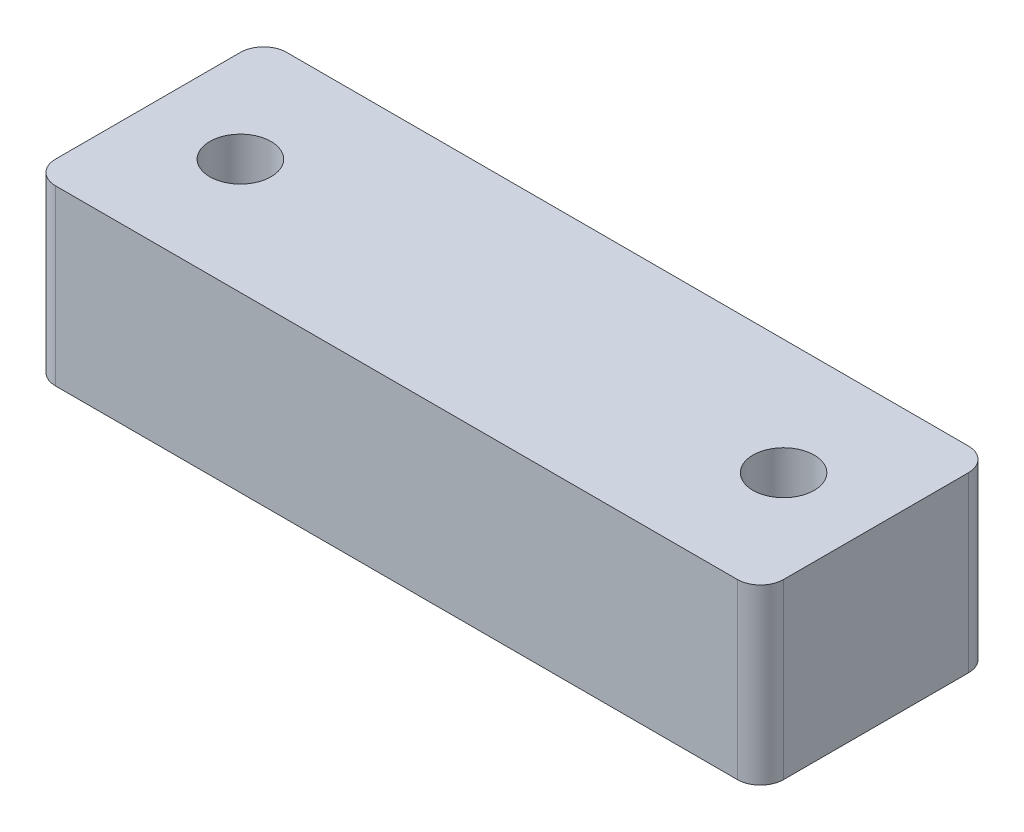
ISO-10303-21;
HEADER;
FILE_DESCRIPTION(('STEP AP214'),'2;1');
FILE_NAME('part.step','',(''),(''),'','','');
FILE_SCHEMA(('AUTOMOTIVE_DESIGN { 1 0 10303 214 1 1 1 1 }'));
ENDSEC;
DATA;
#1=APPLICATION_CONTEXT('core data for automotive mechanical design processes');
#2=APPLICATION_PROTOCOL_DEFINITION('international standard','automotive_design',2000,#1);
#3=PRODUCT_CONTEXT('',#1,'mechanical');
#4=PRODUCT('Part','Part','',(#3));
#5=PRODUCT_RELATED_PRODUCT_CATEGORY('part','',(#4));
#6=PRODUCT_DEFINITION_FORMATION('','',#4);
#7=PRODUCT_DEFINITION_CONTEXT('part definition',#1,'design');
#8=PRODUCT_DEFINITION('design','',#6,#7);
#9=PRODUCT_DEFINITION_SHAPE('','',#8);
#10=(LENGTH_UNIT() NAMED_UNIT(*) SI_UNIT(.MILLI.,.METRE.));
#11=(NAMED_UNIT(*) PLANE_ANGLE_UNIT() SI_UNIT($,.RADIAN.));
#12=(NAMED_UNIT(*) SI_UNIT($,.STERADIAN.) SOLID_ANGLE_UNIT());
#13=UNCERTAINTY_MEASURE_WITH_UNIT(LENGTH_MEASURE(1.E-05),#10,'distance_accuracy_value','');
#14=(GEOMETRIC_REPRESENTATION_CONTEXT(3) GLOBAL_UNCERTAINTY_ASSIGNED_CONTEXT((#13)) GLOBAL_UNIT_ASSIGNED_CONTEXT((#10,
#11,#12)) REPRESENTATION_CONTEXT('',''));
#15=CARTESIAN_POINT('',(0.,0.,0.));
#16=DIRECTION('',(0.,0.,1.));
#17=DIRECTION('',(1.,0.,0.));
#18=AXIS2_PLACEMENT_3D('',#15,#16,#17);
#19=CARTESIAN_POINT('',(-11.5927119727996,15.,-13.4805011423805));
#20=DIRECTION('',(0.,-1.,0.));
#21=DIRECTION('',(0.,0.,-1.));
#22=AXIS2_PLACEMENT_3D('',#19,#20,#21);
#23=CYLINDRICAL_SURFACE('',#22,2.);
#24=CARTESIAN_POINT('',(-11.5927119727996,0.,-13.4805011423805));
#25=DIRECTION('',(0.,1.,0.));
#26=DIRECTION('',(0.,0.,-1.));
#27=AXIS2_PLACEMENT_3D('',#24,#25,#26);
#28=CIRCLE('',#27,2.);
#29=CARTESIAN_POINT('',(-13.5927119727996,0.,-13.4805011423805));
#30=VERTEX_POINT('',#29);
#31=CARTESIAN_POINT('',(-11.5927119727996,0.,-11.4805011423805));
#32=VERTEX_POINT('',#31);
#33=EDGE_CURVE('E165',#30,#32,#28,.T.);
#34=ORIENTED_EDGE('',*,*,#33,.T.);
#35=DIRECTION('',(0.,-1.,0.));
#36=VECTOR('',#35,1.);
#37=CARTESIAN_POINT('',(-11.5927119727996,15.,-11.4805011423805));
#38=LINE('',#37,#36);
#39=CARTESIAN_POINT('',(-11.5927119727996,15.,-11.4805011423805));
#40=VERTEX_POINT('',#39);
#41=EDGE_CURVE('E13',#40,#32,#38,.T.);
#42=ORIENTED_EDGE('',*,*,#41,.F.);
#43=CARTESIAN_POINT('',(-11.5927119727996,15.,-13.4805011423805));
#44=DIRECTION('',(0.,1.,0.));
#45=DIRECTION('',(0.,0.,-1.));
#46=AXIS2_PLACEMENT_3D('',#43,#44,#45);
#47=CIRCLE('',#46,2.);
#48=CARTESIAN_POINT('',(-13.5927119727996,15.,-13.4805011423805));
#49=VERTEX_POINT('',#48);
#50=EDGE_CURVE('E187',#49,#40,#47,.T.);
#51=ORIENTED_EDGE('',*,*,#50,.F.);
#52=DIRECTION('',(0.,-1.,0.));
#53=VECTOR('',#52,1.);
#54=CARTESIAN_POINT('',(-13.5927119727996,15.,-13.4805011423805));
#55=LINE('',#54,#53);
#56=EDGE_CURVE('E161',#49,#30,#55,.T.);
#57=ORIENTED_EDGE('',*,*,#56,.T.);
#58=EDGE_LOOP('',(#34,#42,#51,#57));
#59=FACE_BOUND('',#58,.T.);
#60=ADVANCED_FACE('F50',(#59),#23,.T.);
#61=CARTESIAN_POINT('',(-11.5927119727996,15.,-11.4805011423805));
#62=DIRECTION('',(0.,0.,-1.));
#63=DIRECTION('',(-1.,0.,0.));
#64=AXIS2_PLACEMENT_3D('',#61,#62,#63);
#65=PLANE('',#64);
#66=DIRECTION('',(1.,0.,0.));
#67=VECTOR('',#66,1.);
#68=CARTESIAN_POINT('',(-11.5927119727996,0.,-11.4805011423805));
#69=LINE('',#68,#67);
#70=CARTESIAN_POINT('',(47.4072880272004,0.,-11.4805011423805));
#71=VERTEX_POINT('',#70);
#72=EDGE_CURVE('E169',#32,#71,#69,.T.);
#73=ORIENTED_EDGE('',*,*,#72,.T.);
#74=DIRECTION('',(0.,-1.,0.));
#75=VECTOR('',#74,1.);
#76=CARTESIAN_POINT('',(47.4072880272004,15.,-11.4805011423805));
#77=LINE('',#76,#75);
#78=CARTESIAN_POINT('',(47.4072880272004,15.,-11.4805011423805));
#79=VERTEX_POINT('',#78);
#80=EDGE_CURVE('E59',#79,#71,#77,.T.);
#81=ORIENTED_EDGE('',*,*,#80,.F.);
#82=DIRECTION('',(1.,0.,0.));
#83=VECTOR('',#82,1.);
#84=CARTESIAN_POINT('',(-11.5927119727996,15.,-11.4805011423805));
#85=LINE('',#84,#83);
#86=EDGE_CURVE('E120',#40,#79,#85,.T.);
#87=ORIENTED_EDGE('',*,*,#86,.F.);
#88=ORIENTED_EDGE('',*,*,#41,.T.);
#89=EDGE_LOOP('',(#73,#81,#87,#88));
#90=FACE_BOUND('',#89,.T.);
#91=ADVANCED_FACE('F268',(#90),#65,.F.);
#92=CARTESIAN_POINT('',(47.4072880272004,15.,-13.4805011423805));
#93=DIRECTION('',(0.,-1.,0.));
#94=DIRECTION('',(0.,0.,-1.));
#95=AXIS2_PLACEMENT_3D('',#92,#93,#94);
#96=CYLINDRICAL_SURFACE('',#95,2.);
#97=CARTESIAN_POINT('',(47.4072880272004,0.,-13.4805011423805));
#98=DIRECTION('',(0.,1.,0.));
#99=DIRECTION('',(0.,0.,1.));
#100=AXIS2_PLACEMENT_3D('',#97,#98,#99);
#101=CIRCLE('',#100,2.);
#102=CARTESIAN_POINT('',(49.4072880272004,0.,-13.4805011423805));
#103=VERTEX_POINT('',#102);
#104=EDGE_CURVE('E173',#71,#103,#101,.T.);
#105=ORIENTED_EDGE('',*,*,#104,.T.);
#106=DIRECTION('',(0.,-1.,0.));
#107=VECTOR('',#106,1.);
#108=CARTESIAN_POINT('',(49.4072880272004,15.,-13.4805011423805));
#109=LINE('',#108,#107);
#110=CARTESIAN_POINT('',(49.4072880272004,15.,-13.4805011423805));
#111=VERTEX_POINT('',#110);
#112=EDGE_CURVE('E197',#111,#103,#109,.T.);
#113=ORIENTED_EDGE('',*,*,#112,.F.);
#114=CARTESIAN_POINT('',(47.4072880272004,15.,-13.4805011423805));
#115=DIRECTION('',(0.,1.,0.));
#116=DIRECTION('',(0.,0.,1.));
#117=AXIS2_PLACEMENT_3D('',#114,#115,#116);
#118=CIRCLE('',#117,2.);
#119=EDGE_CURVE('E209',#79,#111,#118,.T.);
#120=ORIENTED_EDGE('',*,*,#119,.F.);
#121=ORIENTED_EDGE('',*,*,#80,.T.);
#122=EDGE_LOOP('',(#105,#113,#120,#121));
#123=FACE_BOUND('',#122,.T.);
#124=ADVANCED_FACE('F207',(#123),#96,.T.);
#125=CARTESIAN_POINT('',(49.4072880272004,15.,-13.4805011423805));
#126=DIRECTION('',(-1.,0.,0.));
#127=DIRECTION('',(0.,0.,1.));
#128=AXIS2_PLACEMENT_3D('',#125,#126,#127);
#129=PLANE('',#128);
#130=DIRECTION('',(0.,0.,-1.));
#131=VECTOR('',#130,1.);
#132=CARTESIAN_POINT('',(49.4072880272004,0.,-13.4805011423805));
#133=LINE('',#132,#131);
#134=CARTESIAN_POINT('',(49.4072880272004,0.,-29.4805011423805));
#135=VERTEX_POINT('',#134);
#136=EDGE_CURVE('E176',#103,#135,#133,.T.);
#137=ORIENTED_EDGE('',*,*,#136,.T.);
#138=DIRECTION('',(0.,-1.,0.));
#139=VECTOR('',#138,1.);
#140=CARTESIAN_POINT('',(49.4072880272004,15.,-29.4805011423805));
#141=LINE('',#140,#139);
#142=CARTESIAN_POINT('',(49.4072880272004,15.,-29.4805011423805));
#143=VERTEX_POINT('',#142);
#144=EDGE_CURVE('E193',#143,#135,#141,.T.);
#145=ORIENTED_EDGE('',*,*,#144,.F.);
#146=DIRECTION('',(0.,0.,-1.));
#147=VECTOR('',#146,1.);
#148=CARTESIAN_POINT('',(49.4072880272004,15.,-13.4805011423805));
#149=LINE('',#148,#147);
#150=EDGE_CURVE('E222',#111,#143,#149,.T.);
#151=ORIENTED_EDGE('',*,*,#150,.F.);
#152=ORIENTED_EDGE('',*,*,#112,.T.);
#153=EDGE_LOOP('',(#137,#145,#151,#152));
#154=FACE_BOUND('',#153,.T.);
#155=ADVANCED_FACE('F217',(#154),#129,.F.);
#156=CARTESIAN_POINT('',(47.4072880272004,15.,-29.4805011423805));
#157=DIRECTION('',(0.,-1.,0.));
#158=DIRECTION('',(0.,0.,-1.));
#159=AXIS2_PLACEMENT_3D('',#156,#157,#158);
#160=CYLINDRICAL_SURFACE('',#159,2.);
#161=CARTESIAN_POINT('',(47.4072880272004,0.,-29.4805011423805));
#162=DIRECTION('',(0.,1.,0.));
#163=DIRECTION('',(0.,0.,-1.));
#164=AXIS2_PLACEMENT_3D('',#161,#162,#163);
#165=CIRCLE('',#164,2.);
#166=CARTESIAN_POINT('',(47.4072880272004,0.,-31.4805011423805));
#167=VERTEX_POINT('',#166);
#168=EDGE_CURVE('E178',#135,#167,#165,.T.);
#169=ORIENTED_EDGE('',*,*,#168,.T.);
#170=DIRECTION('',(0.,-1.,0.));
#171=VECTOR('',#170,1.);
#172=CARTESIAN_POINT('',(47.4072880272004,15.,-31.4805011423805));
#173=LINE('',#172,#171);
#174=CARTESIAN_POINT('',(47.4072880272004,15.,-31.4805011423805));
#175=VERTEX_POINT('',#174);
#176=EDGE_CURVE('E153',#175,#167,#173,.T.);
#177=ORIENTED_EDGE('',*,*,#176,.F.);
#178=CARTESIAN_POINT('',(47.4072880272004,15.,-29.4805011423805));
#179=DIRECTION('',(0.,1.,0.));
#180=DIRECTION('',(0.,0.,-1.));
#181=AXIS2_PLACEMENT_3D('',#178,#179,#180);
#182=CIRCLE('',#181,2.);
#183=EDGE_CURVE('E142',#143,#175,#182,.T.);
#184=ORIENTED_EDGE('',*,*,#183,.F.);
#185=ORIENTED_EDGE('',*,*,#144,.T.);
#186=EDGE_LOOP('',(#169,#177,#184,#185));
#187=FACE_BOUND('',#186,.T.);
#188=ADVANCED_FACE('F220',(#187),#160,.T.);
#189=CARTESIAN_POINT('',(-11.5927119727996,15.,-31.4805011423805));
#190=DIRECTION('',(0.,0.,1.));
#191=DIRECTION('',(1.,0.,0.));
#192=AXIS2_PLACEMENT_3D('',#189,#190,#191);
#193=PLANE('',#192);
#194=DIRECTION('',(-1.,0.,0.));
#195=VECTOR('',#194,1.);
#196=CARTESIAN_POINT('',(-11.5927119727996,0.,-31.4805011423805));
#197=LINE('',#196,#195);
#198=CARTESIAN_POINT('',(-11.5927119727996,0.,-31.4805011423805));
#199=VERTEX_POINT('',#198);
#200=EDGE_CURVE('E151',#167,#199,#197,.T.);
#201=ORIENTED_EDGE('',*,*,#200,.T.);
#202=DIRECTION('',(0.,-1.,0.));
#203=VECTOR('',#202,1.);
#204=CARTESIAN_POINT('',(-11.5927119727996,15.,-31.4805011423805));
#205=LINE('',#204,#203);
#206=CARTESIAN_POINT('',(-11.5927119727996,15.,-31.4805011423805));
#207=VERTEX_POINT('',#206);
#208=EDGE_CURVE('E148',#207,#199,#205,.T.);
#209=ORIENTED_EDGE('',*,*,#208,.F.);
#210=DIRECTION('',(-1.,0.,0.));
#211=VECTOR('',#210,1.);
#212=CARTESIAN_POINT('',(-11.5927119727996,15.,-31.4805011423805));
#213=LINE('',#212,#211);
#214=EDGE_CURVE('E136',#175,#207,#213,.T.);
#215=ORIENTED_EDGE('',*,*,#214,.F.);
#216=ORIENTED_EDGE('',*,*,#176,.T.);
#217=EDGE_LOOP('',(#201,#209,#215,#216));
#218=FACE_BOUND('',#217,.T.);
#219=ADVANCED_FACE('F149',(#218),#193,.F.);
#220=CARTESIAN_POINT('',(-11.5927119727996,15.,-29.4805011423805));
#221=DIRECTION('',(0.,-1.,0.));
#222=DIRECTION('',(0.,0.,-1.));
#223=AXIS2_PLACEMENT_3D('',#220,#221,#222);
#224=CYLINDRICAL_SURFACE('',#223,2.);
#225=CARTESIAN_POINT('',(-11.5927119727996,0.,-29.4805011423805));
#226=DIRECTION('',(0.,1.,0.));
#227=DIRECTION('',(0.,0.,-1.));
#228=AXIS2_PLACEMENT_3D('',#225,#226,#227);
#229=CIRCLE('',#228,2.);
#230=CARTESIAN_POINT('',(-13.5927119727996,0.,-29.4805011423805));
#231=VERTEX_POINT('',#230);
#232=EDGE_CURVE('E104',#199,#231,#229,.T.);
#233=ORIENTED_EDGE('',*,*,#232,.T.);
#234=DIRECTION('',(0.,-1.,0.));
#235=VECTOR('',#234,1.);
#236=CARTESIAN_POINT('',(-13.5927119727996,15.,-29.4805011423805));
#237=LINE('',#236,#235);
#238=CARTESIAN_POINT('',(-13.5927119727996,15.,-29.4805011423805));
#239=VERTEX_POINT('',#238);
#240=EDGE_CURVE('E154',#239,#231,#237,.T.);
#241=ORIENTED_EDGE('',*,*,#240,.F.);
#242=CARTESIAN_POINT('',(-11.5927119727996,15.,-29.4805011423805));
#243=DIRECTION('',(0.,1.,0.));
#244=DIRECTION('',(0.,0.,-1.));
#245=AXIS2_PLACEMENT_3D('',#242,#243,#244);
#246=CIRCLE('',#245,2.);
#247=EDGE_CURVE('E140',#207,#239,#246,.T.);
#248=ORIENTED_EDGE('',*,*,#247,.F.);
#249=ORIENTED_EDGE('',*,*,#208,.T.);
#250=EDGE_LOOP('',(#233,#241,#248,#249));
#251=FACE_BOUND('',#250,.T.);
#252=ADVANCED_FACE('F156',(#251),#224,.T.);
#253=CARTESIAN_POINT('',(-13.5927119727996,15.,-13.4805011423805));
#254=DIRECTION('',(1.,0.,0.));
#255=DIRECTION('',(0.,0.,-1.));
#256=AXIS2_PLACEMENT_3D('',#253,#254,#255);
#257=PLANE('',#256);
#258=DIRECTION('',(0.,0.,1.));
#259=VECTOR('',#258,1.);
#260=CARTESIAN_POINT('',(-13.5927119727996,0.,-13.4805011423805));
#261=LINE('',#260,#259);
#262=EDGE_CURVE('E111',#231,#30,#261,.T.);
#263=ORIENTED_EDGE('',*,*,#262,.T.);
#264=ORIENTED_EDGE('',*,*,#56,.F.);
#265=DIRECTION('',(0.,0.,1.));
#266=VECTOR('',#265,1.);
#267=CARTESIAN_POINT('',(-13.5927119727996,15.,-13.4805011423805));
#268=LINE('',#267,#266);
#269=EDGE_CURVE('E70',#239,#49,#268,.T.);
#270=ORIENTED_EDGE('',*,*,#269,.F.);
#271=ORIENTED_EDGE('',*,*,#240,.T.);
#272=EDGE_LOOP('',(#263,#264,#270,#271));
#273=FACE_BOUND('',#272,.T.);
#274=ADVANCED_FACE('F250',(#273),#257,.F.);
#275=CARTESIAN_POINT('',(-11.5927119727996,15.,-13.4805011423805));
#276=DIRECTION('',(0.,-1.,0.));
#277=DIRECTION('',(0.,0.,-1.));
#278=AXIS2_PLACEMENT_3D('',#275,#276,#277);
#279=PLANE('',#278);
#280=CARTESIAN_POINT('',(-5.59271197279957,15.,-21.4805011423805));
#281=DIRECTION('',(0.,1.,0.));
#282=DIRECTION('',(0.,0.,1.));
#283=AXIS2_PLACEMENT_3D('',#280,#281,#282);
#284=CIRCLE('',#283,2.64999999999999);
#285=CARTESIAN_POINT('',(-5.59271197279957,15.,-18.8305011423805));
#286=VERTEX_POINT('',#285);
#287=EDGE_CURVE('E241',#286,#286,#284,.T.);
#288=ORIENTED_EDGE('',*,*,#287,.F.);
#289=EDGE_LOOP('',(#288));
#290=FACE_BOUND('',#289,.T.);
#291=CARTESIAN_POINT('',(41.4072880272004,15.,-21.4805011423805));
#292=DIRECTION('',(0.,1.,0.));
#293=DIRECTION('',(0.,0.,1.));
#294=AXIS2_PLACEMENT_3D('',#291,#292,#293);
#295=CIRCLE('',#294,2.64999999999999);
#296=CARTESIAN_POINT('',(41.4072880272004,15.,-18.8305011423805));
#297=VERTEX_POINT('',#296);
#298=EDGE_CURVE('E233',#297,#297,#295,.T.);
#299=ORIENTED_EDGE('',*,*,#298,.F.);
#300=EDGE_LOOP('',(#299));
#301=FACE_BOUND('',#300,.T.);
#302=ORIENTED_EDGE('',*,*,#50,.T.);
#303=ORIENTED_EDGE('',*,*,#86,.T.);
#304=ORIENTED_EDGE('',*,*,#119,.T.);
#305=ORIENTED_EDGE('',*,*,#150,.T.);
#306=ORIENTED_EDGE('',*,*,#183,.T.);
#307=ORIENTED_EDGE('',*,*,#214,.T.);
#308=ORIENTED_EDGE('',*,*,#247,.T.);
#309=ORIENTED_EDGE('',*,*,#269,.T.);
#310=EDGE_LOOP('',(#302,#303,#304,#305,#306,#307,#308,#309));
#311=FACE_BOUND('',#310,.T.);
#312=ADVANCED_FACE('F138',(#290,#301,#311),#279,.F.);
#313=CARTESIAN_POINT('',(-11.5927119727996,0.,-13.4805011423805));
#314=DIRECTION('',(0.,-1.,0.));
#315=DIRECTION('',(0.,0.,-1.));
#316=AXIS2_PLACEMENT_3D('',#313,#314,#315);
#317=PLANE('',#316);
#318=CARTESIAN_POINT('',(-5.59271197279957,0.,-21.4805011423805));
#319=DIRECTION('',(0.,1.,0.));
#320=DIRECTION('',(0.,0.,1.));
#321=AXIS2_PLACEMENT_3D('',#318,#319,#320);
#322=CIRCLE('',#321,2.65);
#323=CARTESIAN_POINT('',(-5.59271197279957,0.,-18.8305011423805));
#324=VERTEX_POINT('',#323);
#325=EDGE_CURVE('E237',#324,#324,#322,.T.);
#326=ORIENTED_EDGE('',*,*,#325,.T.);
#327=EDGE_LOOP('',(#326));
#328=FACE_BOUND('',#327,.T.);
#329=CARTESIAN_POINT('',(41.4072880272004,0.,-21.4805011423805));
#330=DIRECTION('',(0.,1.,0.));
#331=DIRECTION('',(0.,0.,1.));
#332=AXIS2_PLACEMENT_3D('',#329,#330,#331);
#333=CIRCLE('',#332,2.65);
#334=CARTESIAN_POINT('',(41.4072880272004,0.,-18.8305011423805));
#335=VERTEX_POINT('',#334);
#336=EDGE_CURVE('E170',#335,#335,#333,.T.);
#337=ORIENTED_EDGE('',*,*,#336,.T.);
#338=EDGE_LOOP('',(#337));
#339=FACE_BOUND('',#338,.T.);
#340=ORIENTED_EDGE('',*,*,#33,.F.);
#341=ORIENTED_EDGE('',*,*,#262,.F.);
#342=ORIENTED_EDGE('',*,*,#232,.F.);
#343=ORIENTED_EDGE('',*,*,#200,.F.);
#344=ORIENTED_EDGE('',*,*,#168,.F.);
#345=ORIENTED_EDGE('',*,*,#136,.F.);
#346=ORIENTED_EDGE('',*,*,#104,.F.);
#347=ORIENTED_EDGE('',*,*,#72,.F.);
#348=EDGE_LOOP('',(#340,#341,#342,#343,#344,#345,#346,#347));
#349=FACE_BOUND('',#348,.T.);
#350=ADVANCED_FACE('F213',(#328,#339,#349),#317,.T.);
#351=CARTESIAN_POINT('',(41.4072880272004,15.,-21.4805011423805));
#352=DIRECTION('',(0.,1.,0.));
#353=DIRECTION('',(0.,0.,1.));
#354=AXIS2_PLACEMENT_3D('',#351,#352,#353);
#355=CYLINDRICAL_SURFACE('',#354,2.64999999999999);
#356=ORIENTED_EDGE('',*,*,#336,.F.);
#357=EDGE_LOOP('',(#356));
#358=FACE_BOUND('',#357,.T.);
#359=ORIENTED_EDGE('',*,*,#298,.T.);
#360=EDGE_LOOP('',(#359));
#361=FACE_BOUND('',#360,.T.);
#362=ADVANCED_FACE('F254',(#358,#361),#355,.F.);
#363=CARTESIAN_POINT('',(-5.59271197279957,15.,-21.4805011423805));
#364=DIRECTION('',(0.,1.,0.));
#365=DIRECTION('',(0.,0.,1.));
#366=AXIS2_PLACEMENT_3D('',#363,#364,#365);
#367=CYLINDRICAL_SURFACE('',#366,2.64999999999999);
#368=ORIENTED_EDGE('',*,*,#325,.F.);
#369=EDGE_LOOP('',(#368));
#370=FACE_BOUND('',#369,.T.);
#371=ORIENTED_EDGE('',*,*,#287,.T.);
#372=EDGE_LOOP('',(#371));
#373=FACE_BOUND('',#372,.T.);
#374=ADVANCED_FACE('F246',(#370,#373),#367,.F.);
#375=CLOSED_SHELL('',(#60,#91,#124,#155,#188,#219,#252,#274,#312,#350,#362,#374));
#376=MANIFOLD_SOLID_BREP('B2',#375);
#377=ADVANCED_BREP_SHAPE_REPRESENTATION('',(#18,#376),#14);
#378=SHAPE_DEFINITION_REPRESENTATION(#9,#377);
ENDSEC;
END-ISO-10303-21;
